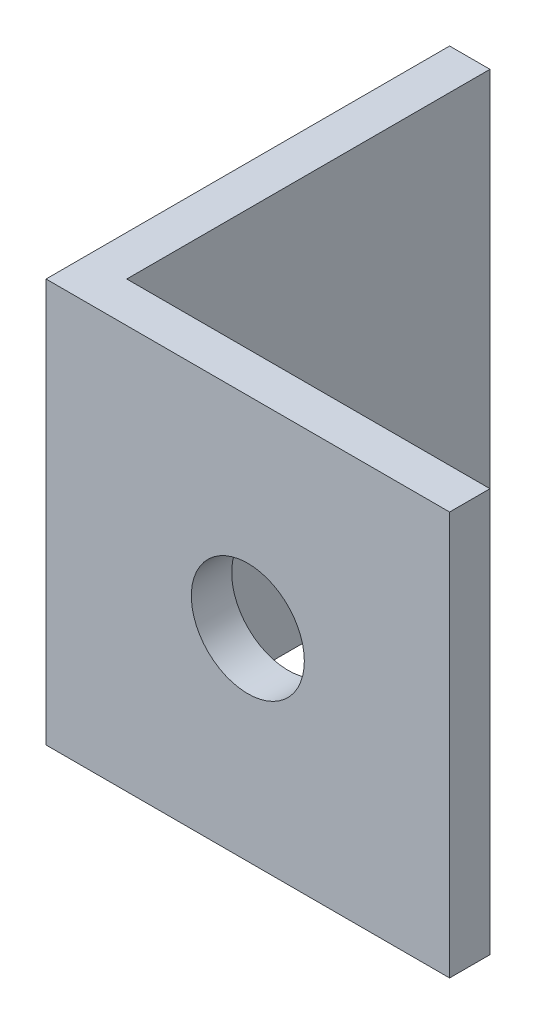
ISO-10303-21;
HEADER;
FILE_DESCRIPTION(('STEP AP214'),'2;1');
FILE_NAME('part.step','',(''),(''),'','','');
FILE_SCHEMA(('AUTOMOTIVE_DESIGN { 1 0 10303 214 1 1 1 1 }'));
ENDSEC;
DATA;
#1=APPLICATION_CONTEXT('core data for automotive mechanical design processes');
#2=APPLICATION_PROTOCOL_DEFINITION('international standard','automotive_design',2000,#1);
#3=PRODUCT_CONTEXT('',#1,'mechanical');
#4=PRODUCT('Part','Part','',(#3));
#5=PRODUCT_RELATED_PRODUCT_CATEGORY('part','',(#4));
#6=PRODUCT_DEFINITION_FORMATION('','',#4);
#7=PRODUCT_DEFINITION_CONTEXT('part definition',#1,'design');
#8=PRODUCT_DEFINITION('design','',#6,#7);
#9=PRODUCT_DEFINITION_SHAPE('','',#8);
#10=(LENGTH_UNIT() NAMED_UNIT(*) SI_UNIT(.MILLI.,.METRE.));
#11=(NAMED_UNIT(*) PLANE_ANGLE_UNIT() SI_UNIT($,.RADIAN.));
#12=(NAMED_UNIT(*) SI_UNIT($,.STERADIAN.) SOLID_ANGLE_UNIT());
#13=UNCERTAINTY_MEASURE_WITH_UNIT(LENGTH_MEASURE(1.E-05),#10,'distance_accuracy_value','');
#14=(GEOMETRIC_REPRESENTATION_CONTEXT(3) GLOBAL_UNCERTAINTY_ASSIGNED_CONTEXT((#13)) GLOBAL_UNIT_ASSIGNED_CONTEXT((#10,
#11,#12)) REPRESENTATION_CONTEXT('',''));
#15=CARTESIAN_POINT('',(0.,0.,0.));
#16=DIRECTION('',(0.,0.,1.));
#17=DIRECTION('',(1.,0.,0.));
#18=AXIS2_PLACEMENT_3D('',#15,#16,#17);
#19=CARTESIAN_POINT('',(0.,0.,5.));
#20=DIRECTION('',(0.,0.,-1.));
#21=DIRECTION('',(-1.,0.,0.));
#22=AXIS2_PLACEMENT_3D('',#19,#20,#21);
#23=PLANE('',#22);
#24=DIRECTION('',(-1.,0.,0.));
#25=VECTOR('',#24,1.);
#26=CARTESIAN_POINT('',(-25.,25.,5.));
#27=LINE('',#26,#25);
#28=CARTESIAN_POINT('',(25.,25.,5.));
#29=VERTEX_POINT('',#28);
#30=CARTESIAN_POINT('',(-25.,25.,5.));
#31=VERTEX_POINT('',#30);
#32=EDGE_CURVE('E86',#29,#31,#27,.T.);
#33=ORIENTED_EDGE('',*,*,#32,.T.);
#34=DIRECTION('',(0.,-1.,0.));
#35=VECTOR('',#34,1.);
#36=CARTESIAN_POINT('',(-25.,-25.,5.));
#37=LINE('',#36,#35);
#38=CARTESIAN_POINT('',(-25.,-25.,5.));
#39=VERTEX_POINT('',#38);
#40=EDGE_CURVE('E90',#31,#39,#37,.T.);
#41=ORIENTED_EDGE('',*,*,#40,.T.);
#42=DIRECTION('',(1.,0.,0.));
#43=VECTOR('',#42,1.);
#44=CARTESIAN_POINT('',(-25.,-25.,5.));
#45=LINE('',#44,#43);
#46=CARTESIAN_POINT('',(25.,-25.,5.));
#47=VERTEX_POINT('',#46);
#48=EDGE_CURVE('E57',#39,#47,#45,.T.);
#49=ORIENTED_EDGE('',*,*,#48,.T.);
#50=DIRECTION('',(0.,1.,0.));
#51=VECTOR('',#50,1.);
#52=CARTESIAN_POINT('',(25.,-25.,5.));
#53=LINE('',#52,#51);
#54=EDGE_CURVE('E93',#47,#29,#53,.T.);
#55=ORIENTED_EDGE('',*,*,#54,.T.);
#56=EDGE_LOOP('',(#33,#41,#49,#55));
#57=FACE_BOUND('',#56,.T.);
#58=CARTESIAN_POINT('',(0.,0.,5.));
#59=DIRECTION('',(0.,0.,1.));
#60=DIRECTION('',(1.,0.,0.));
#61=AXIS2_PLACEMENT_3D('',#58,#59,#60);
#62=CIRCLE('',#61,7.);
#63=CARTESIAN_POINT('',(7.,0.,5.));
#64=VERTEX_POINT('',#63);
#65=EDGE_CURVE('E122',#64,#64,#62,.T.);
#66=ORIENTED_EDGE('',*,*,#65,.F.);
#67=EDGE_LOOP('',(#66));
#68=FACE_BOUND('',#67,.T.);
#69=ADVANCED_FACE('F39',(#57,#68),#23,.F.);
#70=CARTESIAN_POINT('',(0.,0.,0.));
#71=DIRECTION('',(0.,0.,-1.));
#72=DIRECTION('',(-1.,0.,0.));
#73=AXIS2_PLACEMENT_3D('',#70,#71,#72);
#74=PLANE('',#73);
#75=DIRECTION('',(0.,-1.,0.));
#76=VECTOR('',#75,1.);
#77=CARTESIAN_POINT('',(-20.,0.,0.));
#78=LINE('',#77,#76);
#79=CARTESIAN_POINT('',(-20.,25.,0.));
#80=VERTEX_POINT('',#79);
#81=CARTESIAN_POINT('',(-20.,-25.,0.));
#82=VERTEX_POINT('',#81);
#83=EDGE_CURVE('E147',#80,#82,#78,.T.);
#84=ORIENTED_EDGE('',*,*,#83,.F.);
#85=DIRECTION('',(-1.,0.,0.));
#86=VECTOR('',#85,1.);
#87=CARTESIAN_POINT('',(-25.,25.,0.));
#88=LINE('',#87,#86);
#89=CARTESIAN_POINT('',(25.,25.,0.));
#90=VERTEX_POINT('',#89);
#91=EDGE_CURVE('E69',#90,#80,#88,.T.);
#92=ORIENTED_EDGE('',*,*,#91,.F.);
#93=DIRECTION('',(0.,1.,0.));
#94=VECTOR('',#93,1.);
#95=CARTESIAN_POINT('',(25.,-25.,0.));
#96=LINE('',#95,#94);
#97=CARTESIAN_POINT('',(25.,-25.,0.));
#98=VERTEX_POINT('',#97);
#99=EDGE_CURVE('E118',#98,#90,#96,.T.);
#100=ORIENTED_EDGE('',*,*,#99,.F.);
#101=DIRECTION('',(1.,0.,0.));
#102=VECTOR('',#101,1.);
#103=CARTESIAN_POINT('',(-25.,-25.,0.));
#104=LINE('',#103,#102);
#105=EDGE_CURVE('E125',#82,#98,#104,.T.);
#106=ORIENTED_EDGE('',*,*,#105,.F.);
#107=EDGE_LOOP('',(#84,#92,#100,#106));
#108=FACE_BOUND('',#107,.T.);
#109=CARTESIAN_POINT('',(0.,0.,0.));
#110=DIRECTION('',(0.,0.,1.));
#111=DIRECTION('',(1.,0.,0.));
#112=AXIS2_PLACEMENT_3D('',#109,#110,#111);
#113=CIRCLE('',#112,7.);
#114=CARTESIAN_POINT('',(7.,0.,0.));
#115=VERTEX_POINT('',#114);
#116=EDGE_CURVE('E161',#115,#115,#113,.T.);
#117=ORIENTED_EDGE('',*,*,#116,.T.);
#118=EDGE_LOOP('',(#117));
#119=FACE_BOUND('',#118,.T.);
#120=ADVANCED_FACE('F171',(#108,#119),#74,.T.);
#121=CARTESIAN_POINT('',(25.,-25.,5.));
#122=DIRECTION('',(-1.,0.,0.));
#123=DIRECTION('',(0.,0.,1.));
#124=AXIS2_PLACEMENT_3D('',#121,#122,#123);
#125=PLANE('',#124);
#126=ORIENTED_EDGE('',*,*,#99,.T.);
#127=DIRECTION('',(0.,0.,-1.));
#128=VECTOR('',#127,1.);
#129=CARTESIAN_POINT('',(25.,25.,5.));
#130=LINE('',#129,#128);
#131=EDGE_CURVE('E11',#29,#90,#130,.T.);
#132=ORIENTED_EDGE('',*,*,#131,.F.);
#133=ORIENTED_EDGE('',*,*,#54,.F.);
#134=DIRECTION('',(0.,0.,-1.));
#135=VECTOR('',#134,1.);
#136=CARTESIAN_POINT('',(25.,-25.,5.));
#137=LINE('',#136,#135);
#138=EDGE_CURVE('E114',#47,#98,#137,.T.);
#139=ORIENTED_EDGE('',*,*,#138,.T.);
#140=EDGE_LOOP('',(#126,#132,#133,#139));
#141=FACE_BOUND('',#140,.T.);
#142=ADVANCED_FACE('F41',(#141),#125,.F.);
#143=CARTESIAN_POINT('',(-25.,25.,5.));
#144=DIRECTION('',(0.,-1.,0.));
#145=DIRECTION('',(0.,0.,-1.));
#146=AXIS2_PLACEMENT_3D('',#143,#144,#145);
#147=PLANE('',#146);
#148=ORIENTED_EDGE('',*,*,#91,.T.);
#149=DIRECTION('',(0.,0.,-1.));
#150=VECTOR('',#149,1.);
#151=CARTESIAN_POINT('',(-20.,25.,5.));
#152=LINE('',#151,#150);
#153=CARTESIAN_POINT('',(-20.,25.,-45.));
#154=VERTEX_POINT('',#153);
#155=EDGE_CURVE('E79',#80,#154,#152,.T.);
#156=ORIENTED_EDGE('',*,*,#155,.T.);
#157=DIRECTION('',(-1.,0.,0.));
#158=VECTOR('',#157,1.);
#159=CARTESIAN_POINT('',(-20.,25.,-45.));
#160=LINE('',#159,#158);
#161=CARTESIAN_POINT('',(-25.,25.,-45.));
#162=VERTEX_POINT('',#161);
#163=EDGE_CURVE('E103',#154,#162,#160,.T.);
#164=ORIENTED_EDGE('',*,*,#163,.T.);
#165=DIRECTION('',(0.,0.,-1.));
#166=VECTOR('',#165,1.);
#167=CARTESIAN_POINT('',(-25.,25.,5.));
#168=LINE('',#167,#166);
#169=EDGE_CURVE('E49',#31,#162,#168,.T.);
#170=ORIENTED_EDGE('',*,*,#169,.F.);
#171=ORIENTED_EDGE('',*,*,#32,.F.);
#172=ORIENTED_EDGE('',*,*,#131,.T.);
#173=EDGE_LOOP('',(#148,#156,#164,#170,#171,#172));
#174=FACE_BOUND('',#173,.T.);
#175=ADVANCED_FACE('F100',(#174),#147,.F.);
#176=CARTESIAN_POINT('',(-25.,-25.,5.));
#177=DIRECTION('',(1.,0.,0.));
#178=DIRECTION('',(0.,0.,-1.));
#179=AXIS2_PLACEMENT_3D('',#176,#177,#178);
#180=PLANE('',#179);
#181=ORIENTED_EDGE('',*,*,#169,.T.);
#182=DIRECTION('',(0.,-1.,0.));
#183=VECTOR('',#182,1.);
#184=CARTESIAN_POINT('',(-25.,25.,-45.));
#185=LINE('',#184,#183);
#186=CARTESIAN_POINT('',(-25.,-25.,-45.));
#187=VERTEX_POINT('',#186);
#188=EDGE_CURVE('E143',#162,#187,#185,.T.);
#189=ORIENTED_EDGE('',*,*,#188,.T.);
#190=DIRECTION('',(0.,0.,-1.));
#191=VECTOR('',#190,1.);
#192=CARTESIAN_POINT('',(-25.,-25.,5.));
#193=LINE('',#192,#191);
#194=EDGE_CURVE('E108',#39,#187,#193,.T.);
#195=ORIENTED_EDGE('',*,*,#194,.F.);
#196=ORIENTED_EDGE('',*,*,#40,.F.);
#197=EDGE_LOOP('',(#181,#189,#195,#196));
#198=FACE_BOUND('',#197,.T.);
#199=ADVANCED_FACE('F109',(#198),#180,.F.);
#200=CARTESIAN_POINT('',(-25.,-25.,5.));
#201=DIRECTION('',(0.,1.,0.));
#202=DIRECTION('',(0.,0.,1.));
#203=AXIS2_PLACEMENT_3D('',#200,#201,#202);
#204=PLANE('',#203);
#205=ORIENTED_EDGE('',*,*,#138,.F.);
#206=ORIENTED_EDGE('',*,*,#48,.F.);
#207=ORIENTED_EDGE('',*,*,#194,.T.);
#208=DIRECTION('',(-1.,0.,0.));
#209=VECTOR('',#208,1.);
#210=CARTESIAN_POINT('',(-20.,-25.,-45.));
#211=LINE('',#210,#209);
#212=CARTESIAN_POINT('',(-20.,-25.,-45.));
#213=VERTEX_POINT('',#212);
#214=EDGE_CURVE('E138',#213,#187,#211,.T.);
#215=ORIENTED_EDGE('',*,*,#214,.F.);
#216=DIRECTION('',(0.,0.,1.));
#217=VECTOR('',#216,1.);
#218=CARTESIAN_POINT('',(-20.,-25.,5.));
#219=LINE('',#218,#217);
#220=EDGE_CURVE('E154',#213,#82,#219,.T.);
#221=ORIENTED_EDGE('',*,*,#220,.T.);
#222=ORIENTED_EDGE('',*,*,#105,.T.);
#223=EDGE_LOOP('',(#205,#206,#207,#215,#221,#222));
#224=FACE_BOUND('',#223,.T.);
#225=ADVANCED_FACE('F136',(#224),#204,.F.);
#226=CARTESIAN_POINT('',(0.,0.,5.));
#227=DIRECTION('',(0.,0.,-1.));
#228=DIRECTION('',(-1.,0.,0.));
#229=AXIS2_PLACEMENT_3D('',#226,#227,#228);
#230=CYLINDRICAL_SURFACE('',#229,7.);
#231=ORIENTED_EDGE('',*,*,#65,.T.);
#232=EDGE_LOOP('',(#231));
#233=FACE_BOUND('',#232,.T.);
#234=ORIENTED_EDGE('',*,*,#116,.F.);
#235=EDGE_LOOP('',(#234));
#236=FACE_BOUND('',#235,.T.);
#237=ADVANCED_FACE('F181',(#233,#236),#230,.F.);
#238=CARTESIAN_POINT('',(-20.,25.,-45.));
#239=DIRECTION('',(0.,0.,-1.));
#240=DIRECTION('',(0.,1.,0.));
#241=AXIS2_PLACEMENT_3D('',#238,#239,#240);
#242=PLANE('',#241);
#243=ORIENTED_EDGE('',*,*,#188,.F.);
#244=ORIENTED_EDGE('',*,*,#163,.F.);
#245=DIRECTION('',(0.,-1.,0.));
#246=VECTOR('',#245,1.);
#247=CARTESIAN_POINT('',(-20.,25.,-45.));
#248=LINE('',#247,#246);
#249=EDGE_CURVE('E144',#154,#213,#248,.T.);
#250=ORIENTED_EDGE('',*,*,#249,.T.);
#251=ORIENTED_EDGE('',*,*,#214,.T.);
#252=EDGE_LOOP('',(#243,#244,#250,#251));
#253=FACE_BOUND('',#252,.T.);
#254=ADVANCED_FACE('F142',(#253),#242,.T.);
#255=CARTESIAN_POINT('',(-20.,0.,0.));
#256=DIRECTION('',(1.,0.,0.));
#257=DIRECTION('',(0.,0.,-1.));
#258=AXIS2_PLACEMENT_3D('',#255,#256,#257);
#259=PLANE('',#258);
#260=ORIENTED_EDGE('',*,*,#155,.F.);
#261=ORIENTED_EDGE('',*,*,#83,.T.);
#262=ORIENTED_EDGE('',*,*,#220,.F.);
#263=ORIENTED_EDGE('',*,*,#249,.F.);
#264=EDGE_LOOP('',(#260,#261,#262,#263));
#265=FACE_BOUND('',#264,.T.);
#266=ADVANCED_FACE('F175',(#265),#259,.T.);
#267=CLOSED_SHELL('',(#69,#120,#142,#175,#199,#225,#237,#254,#266));
#268=MANIFOLD_SOLID_BREP('B2',#267);
#269=ADVANCED_BREP_SHAPE_REPRESENTATION('',(#18,#268),#14);
#270=SHAPE_DEFINITION_REPRESENTATION(#9,#269);
ENDSEC;
END-ISO-10303-21;
